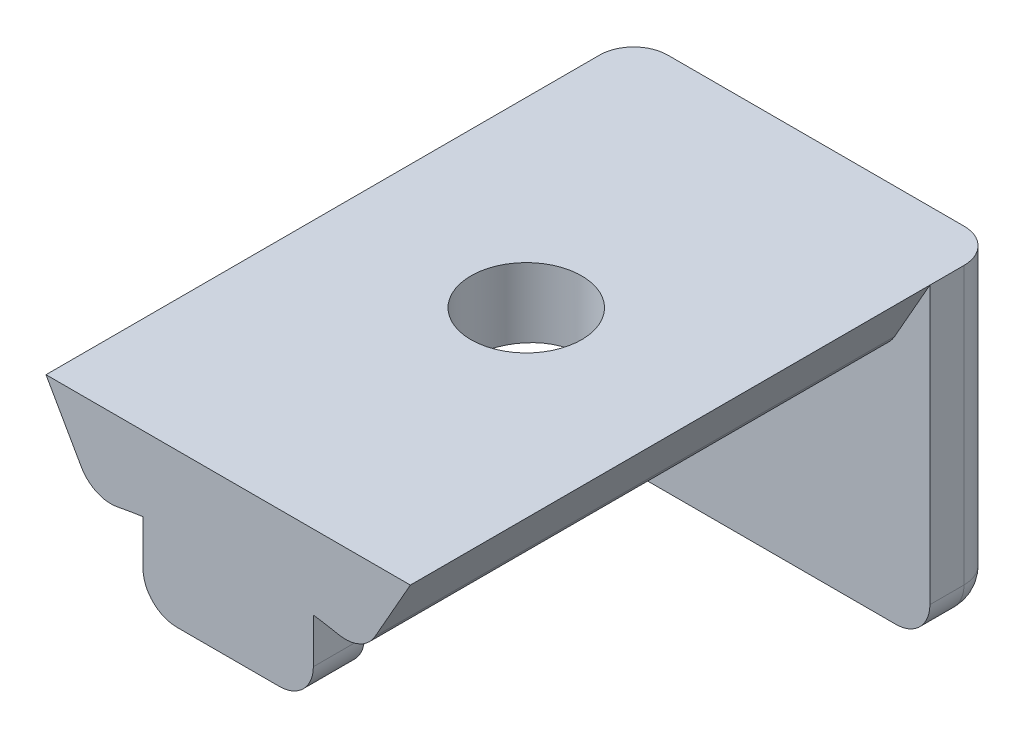
ISO-10303-21;
HEADER;
FILE_DESCRIPTION(('STEP AP214'),'2;1');
FILE_NAME('part.step','',(''),(''),'','','');
FILE_SCHEMA(('AUTOMOTIVE_DESIGN { 1 0 10303 214 1 1 1 1 }'));
ENDSEC;
DATA;
#1=APPLICATION_CONTEXT('core data for automotive mechanical design processes');
#2=APPLICATION_PROTOCOL_DEFINITION('international standard','automotive_design',2000,#1);
#3=PRODUCT_CONTEXT('',#1,'mechanical');
#4=PRODUCT('Part','Part','',(#3));
#5=PRODUCT_RELATED_PRODUCT_CATEGORY('part','',(#4));
#6=PRODUCT_DEFINITION_FORMATION('','',#4);
#7=PRODUCT_DEFINITION_CONTEXT('part definition',#1,'design');
#8=PRODUCT_DEFINITION('design','',#6,#7);
#9=PRODUCT_DEFINITION_SHAPE('','',#8);
#10=(LENGTH_UNIT() NAMED_UNIT(*) SI_UNIT(.MILLI.,.METRE.));
#11=(NAMED_UNIT(*) PLANE_ANGLE_UNIT() SI_UNIT($,.RADIAN.));
#12=(NAMED_UNIT(*) SI_UNIT($,.STERADIAN.) SOLID_ANGLE_UNIT());
#13=UNCERTAINTY_MEASURE_WITH_UNIT(LENGTH_MEASURE(1.E-05),#10,'distance_accuracy_value','');
#14=(GEOMETRIC_REPRESENTATION_CONTEXT(3) GLOBAL_UNCERTAINTY_ASSIGNED_CONTEXT((#13)) GLOBAL_UNIT_ASSIGNED_CONTEXT((#10,
#11,#12)) REPRESENTATION_CONTEXT('',''));
#15=CARTESIAN_POINT('',(0.,0.,0.));
#16=DIRECTION('',(0.,0.,1.));
#17=DIRECTION('',(1.,0.,0.));
#18=AXIS2_PLACEMENT_3D('',#15,#16,#17);
#19=CARTESIAN_POINT('',(-10.6947636705695,4.,30.5));
#20=DIRECTION('',(0.,-1.,0.));
#21=DIRECTION('',(0.,0.,-1.));
#22=AXIS2_PLACEMENT_3D('',#19,#20,#21);
#23=PLANE('',#22);
#24=DIRECTION('',(-1.,0.,0.));
#25=VECTOR('',#24,1.);
#26=CARTESIAN_POINT('',(10.6947636705695,4.,-4.));
#27=LINE('',#26,#25);
#28=CARTESIAN_POINT('',(8.69476367056949,4.,-4.));
#29=VERTEX_POINT('',#28);
#30=CARTESIAN_POINT('',(-8.6947636705695,4.,-4.));
#31=VERTEX_POINT('',#30);
#32=EDGE_CURVE('E225',#29,#31,#27,.T.);
#33=ORIENTED_EDGE('',*,*,#32,.T.);
#34=CARTESIAN_POINT('',(-8.69476367056949,4.,-2.));
#35=DIRECTION('',(0.,-1.,0.));
#36=DIRECTION('',(0.,0.,-1.));
#37=AXIS2_PLACEMENT_3D('',#34,#35,#36);
#38=CIRCLE('',#37,2.);
#39=CARTESIAN_POINT('',(-10.6947636705695,4.,-2.));
#40=VERTEX_POINT('',#39);
#41=EDGE_CURVE('E413',#31,#40,#38,.F.);
#42=ORIENTED_EDGE('',*,*,#41,.T.);
#43=DIRECTION('',(0.,0.,1.));
#44=VECTOR('',#43,1.);
#45=CARTESIAN_POINT('',(-10.6947636705695,4.,-4.));
#46=LINE('',#45,#44);
#47=CARTESIAN_POINT('',(-10.6947636705695,4.,0.));
#48=VERTEX_POINT('',#47);
#49=EDGE_CURVE('E247',#40,#48,#46,.T.);
#50=ORIENTED_EDGE('',*,*,#49,.T.);
#51=DIRECTION('',(0.,0.,-1.));
#52=VECTOR('',#51,1.);
#53=CARTESIAN_POINT('',(-10.6947636705695,4.,30.5));
#54=LINE('',#53,#52);
#55=CARTESIAN_POINT('',(-10.6947636705695,4.,30.5));
#56=VERTEX_POINT('',#55);
#57=EDGE_CURVE('E299',#56,#48,#54,.T.);
#58=ORIENTED_EDGE('',*,*,#57,.F.);
#59=DIRECTION('',(-1.,0.,0.));
#60=VECTOR('',#59,1.);
#61=CARTESIAN_POINT('',(-10.6947636705695,4.,30.5));
#62=LINE('',#61,#60);
#63=CARTESIAN_POINT('',(10.6947636705695,4.,30.5));
#64=VERTEX_POINT('',#63);
#65=EDGE_CURVE('E256',#64,#56,#62,.T.);
#66=ORIENTED_EDGE('',*,*,#65,.F.);
#67=DIRECTION('',(0.,0.,-1.));
#68=VECTOR('',#67,1.);
#69=CARTESIAN_POINT('',(10.6947636705695,4.,30.5));
#70=LINE('',#69,#68);
#71=CARTESIAN_POINT('',(10.6947636705695,4.,0.));
#72=VERTEX_POINT('',#71);
#73=EDGE_CURVE('E271',#64,#72,#70,.T.);
#74=ORIENTED_EDGE('',*,*,#73,.T.);
#75=DIRECTION('',(0.,0.,1.));
#76=VECTOR('',#75,1.);
#77=CARTESIAN_POINT('',(10.6947636705695,4.,-4.));
#78=LINE('',#77,#76);
#79=CARTESIAN_POINT('',(10.6947636705695,4.,-2.));
#80=VERTEX_POINT('',#79);
#81=EDGE_CURVE('E249',#80,#72,#78,.T.);
#82=ORIENTED_EDGE('',*,*,#81,.F.);
#83=CARTESIAN_POINT('',(8.69476367056949,4.,-2.));
#84=DIRECTION('',(0.,-1.,0.));
#85=DIRECTION('',(0.,0.,-1.));
#86=AXIS2_PLACEMENT_3D('',#83,#84,#85);
#87=CIRCLE('',#86,2.);
#88=EDGE_CURVE('E415',#80,#29,#87,.F.);
#89=ORIENTED_EDGE('',*,*,#88,.T.);
#90=EDGE_LOOP('',(#33,#42,#50,#58,#66,#74,#82,#89));
#91=FACE_BOUND('',#90,.T.);
#92=CARTESIAN_POINT('',(0.,4.,13.));
#93=DIRECTION('',(0.,1.,0.));
#94=DIRECTION('',(0.,0.,1.));
#95=AXIS2_PLACEMENT_3D('',#92,#93,#94);
#96=CIRCLE('',#95,3.25);
#97=CARTESIAN_POINT('',(0.,4.,16.25));
#98=VERTEX_POINT('',#97);
#99=EDGE_CURVE('E221',#98,#98,#96,.T.);
#100=ORIENTED_EDGE('',*,*,#99,.F.);
#101=EDGE_LOOP('',(#100));
#102=FACE_BOUND('',#101,.T.);
#103=ADVANCED_FACE('F40',(#91,#102),#23,.F.);
#104=CARTESIAN_POINT('',(-8.6215749684711,0.348529624949165,30.5));
#105=DIRECTION('',(0.869611013647313,0.49373746560626,0.));
#106=DIRECTION('',(-0.49373746560626,0.869611013647313,0.));
#107=AXIS2_PLACEMENT_3D('',#104,#105,#106);
#108=PLANE('',#107);
#109=DIRECTION('',(0.49373746560626,-0.869611013647313,0.));
#110=VECTOR('',#109,1.);
#111=CARTESIAN_POINT('',(-8.6215749684711,0.348529624949165,0.));
#112=LINE('',#111,#110);
#113=CARTESIAN_POINT('',(-8.6215749684711,0.348529624949165,0.));
#114=VERTEX_POINT('',#113);
#115=EDGE_CURVE('E246',#48,#114,#112,.T.);
#116=ORIENTED_EDGE('',*,*,#115,.T.);
#117=DIRECTION('',(0.,0.,-1.));
#118=VECTOR('',#117,1.);
#119=CARTESIAN_POINT('',(-8.6215749684711,0.348529624949165,30.5));
#120=LINE('',#119,#118);
#121=CARTESIAN_POINT('',(-8.6215749684711,0.348529624949165,30.5));
#122=VERTEX_POINT('',#121);
#123=EDGE_CURVE('E296',#122,#114,#120,.T.);
#124=ORIENTED_EDGE('',*,*,#123,.F.);
#125=DIRECTION('',(0.49373746560626,-0.869611013647313,0.));
#126=VECTOR('',#125,1.);
#127=CARTESIAN_POINT('',(-8.6215749684711,0.348529624949165,30.5));
#128=LINE('',#127,#126);
#129=EDGE_CURVE('E258',#56,#122,#128,.T.);
#130=ORIENTED_EDGE('',*,*,#129,.F.);
#131=ORIENTED_EDGE('',*,*,#57,.T.);
#132=EDGE_LOOP('',(#116,#124,#130,#131));
#133=FACE_BOUND('',#132,.T.);
#134=ADVANCED_FACE('F364',(#133),#108,.F.);
#135=CARTESIAN_POINT('',(-6.88235294117647,1.33600455616169,30.5));
#136=DIRECTION('',(0.,0.,-1.));
#137=DIRECTION('',(-1.,0.,0.));
#138=AXIS2_PLACEMENT_3D('',#135,#136,#137);
#139=CYLINDRICAL_SURFACE('',#138,2.);
#140=CARTESIAN_POINT('',(-6.88235294117647,1.33600455616169,0.));
#141=DIRECTION('',(0.,0.,1.));
#142=DIRECTION('',(-1.,0.,0.));
#143=AXIS2_PLACEMENT_3D('',#140,#141,#142);
#144=CIRCLE('',#143,2.);
#145=CARTESIAN_POINT('',(-6.5,-0.62710680806952,0.));
#146=VERTEX_POINT('',#145);
#147=EDGE_CURVE('E274',#114,#146,#144,.T.);
#148=ORIENTED_EDGE('',*,*,#147,.T.);
#149=DIRECTION('',(0.,0.,-1.));
#150=VECTOR('',#149,1.);
#151=CARTESIAN_POINT('',(-6.5,-0.62710680806952,30.5));
#152=LINE('',#151,#150);
#153=CARTESIAN_POINT('',(-6.5,-0.62710680806952,30.5));
#154=VERTEX_POINT('',#153);
#155=EDGE_CURVE('E293',#154,#146,#152,.T.);
#156=ORIENTED_EDGE('',*,*,#155,.F.);
#157=CARTESIAN_POINT('',(-6.88235294117647,1.33600455616169,30.5));
#158=DIRECTION('',(0.,0.,1.));
#159=DIRECTION('',(-1.,0.,0.));
#160=AXIS2_PLACEMENT_3D('',#157,#158,#159);
#161=CIRCLE('',#160,2.);
#162=EDGE_CURVE('E261',#122,#154,#161,.T.);
#163=ORIENTED_EDGE('',*,*,#162,.F.);
#164=ORIENTED_EDGE('',*,*,#123,.T.);
#165=EDGE_LOOP('',(#148,#156,#163,#164));
#166=FACE_BOUND('',#165,.T.);
#167=ADVANCED_FACE('F361',(#166),#139,.T.);
#168=CARTESIAN_POINT('',(0.,-34.,30.5));
#169=DIRECTION('',(0.,0.,-1.));
#170=DIRECTION('',(-1.,0.,0.));
#171=AXIS2_PLACEMENT_3D('',#168,#169,#170);
#172=CYLINDRICAL_SURFACE('',#171,34.);
#173=CARTESIAN_POINT('',(0.,0.,16.25));
#174=CARTESIAN_POINT('',(0.182108090976461,-2.01231959354162E-06,16.2499920938725));
#175=CARTESIAN_POINT('',(0.36433759154989,-0.00147865018620512,16.234642315712));
#176=CARTESIAN_POINT('',(0.723747356741201,-0.00722726483149422,16.1736391436953));
#177=CARTESIAN_POINT('',(0.900921785860087,-0.0115023458534744,16.1279520966506));
#178=CARTESIAN_POINT('',(1.24496454926346,-0.0223651185921683,16.0076140437996));
#179=CARTESIAN_POINT('',(1.41183892937562,-0.0289514382041059,15.9329802199622));
#180=CARTESIAN_POINT('',(1.7306545161744,-0.0436996150683219,15.7568998265236));
#181=CARTESIAN_POINT('',(1.88259874704598,-0.051861152254592,15.6554587023127));
#182=CARTESIAN_POINT('',(2.16778012306537,-0.0688752144983296,15.4282831560279));
#183=CARTESIAN_POINT('',(2.30096106569485,-0.0777296969172881,15.30247832106));
#184=CARTESIAN_POINT('',(2.5443525054445,-0.0951154428300179,15.0302963554583));
#185=CARTESIAN_POINT('',(2.65456195552963,-0.103646691576382,14.8839182876104));
#186=CARTESIAN_POINT('',(2.84907880479306,-0.119440288151361,14.5743961139137));
#187=CARTESIAN_POINT('',(2.93333571707974,-0.12670015099959,14.4112201422965));
#188=CARTESIAN_POINT('',(3.07323334550535,-0.13910517499152,14.0729553942709));
#189=CARTESIAN_POINT('',(3.12887471146925,-0.144250384155953,13.8978668884841));
#190=CARTESIAN_POINT('',(3.2097960787319,-0.151826151087931,13.5413179261722));
#191=CARTESIAN_POINT('',(3.23516889130796,-0.154265005630627,13.3598787130626));
#192=CARTESIAN_POINT('',(3.25511975897105,-0.156177799040296,12.9953018552829));
#193=CARTESIAN_POINT('',(3.24969855799879,-0.155651809533798,12.8121642517502));
#194=CARTESIAN_POINT('',(3.20829184034402,-0.151701912648619,12.4500279346104));
#195=CARTESIAN_POINT('',(3.1724075273935,-0.148287600908132,12.2710175300038));
#196=CARTESIAN_POINT('',(3.07125061276453,-0.13896077077724,11.921571883309));
#197=CARTESIAN_POINT('',(3.00597764498416,-0.13304822126571,11.7511367480745));
#198=CARTESIAN_POINT('',(2.84778411916793,-0.119380064895267,11.4233591731244));
#199=CARTESIAN_POINT('',(2.75481851809185,-0.111621459531144,11.2660386024036));
#200=CARTESIAN_POINT('',(2.5439110727067,-0.0951379869244641,10.9691951732876));
#201=CARTESIAN_POINT('',(2.42596856085774,-0.0864130938596052,10.8296727907315));
#202=CARTESIAN_POINT('',(2.1678893307881,-0.0689373778213708,10.5717980749409));
#203=CARTESIAN_POINT('',(2.02766518519003,-0.0601865918422638,10.4535332182617));
#204=CARTESIAN_POINT('',(1.72930712081834,-0.0436783259093938,10.242208200948));
#205=CARTESIAN_POINT('',(1.57117318449841,-0.035920846928794,10.1491480650071));
#206=CARTESIAN_POINT('',(1.24142483016382,-0.0222710199435436,9.99087818007493));
#207=CARTESIAN_POINT('',(1.06980834570561,-0.0163789585465816,9.92567271021126));
#208=CARTESIAN_POINT('',(0.717994332847011,-0.00712685715426361,9.82502640227539));
#209=CARTESIAN_POINT('',(0.537797039004437,-0.0037667479897767,9.78958475109735));
#210=CARTESIAN_POINT('',(0.174694288985642,3.39739927161618E-05,9.749582746877));
#211=CARTESIAN_POINT('',(-0.0081977506963202,0.000486001721109767,9.74490164980035));
#212=CARTESIAN_POINT('',(-0.372163826977215,-0.00154979628964528,9.76623673430385));
#213=CARTESIAN_POINT('',(-0.55323788595604,-0.0040375857938915,9.79225253752742));
#214=CARTESIAN_POINT('',(-0.908080662509738,-0.0116660794077149,9.8741427848582));
#215=CARTESIAN_POINT('',(-1.08186250698855,-0.0168017740412119,9.92996085419838));
#216=CARTESIAN_POINT('',(-1.41759546448642,-0.0291497089127371,10.0698133293091));
#217=CARTESIAN_POINT('',(-1.57954633396584,-0.0363619918820711,10.1538483157235));
#218=CARTESIAN_POINT('',(-1.88756708092171,-0.0520843150564836,10.3480497498912));
#219=CARTESIAN_POINT('',(-2.03358662113286,-0.0605982755791045,10.4582957145876));
#220=CARTESIAN_POINT('',(-2.30509061187851,-0.0779555278618262,10.7016753735345));
#221=CARTESIAN_POINT('',(-2.43057459197797,-0.0867988271608277,10.8348095919731));
#222=CARTESIAN_POINT('',(-2.65786324530359,-0.103852254205845,11.1207126017862));
#223=CARTESIAN_POINT('',(-2.7595888006263,-0.112060207194943,11.2735444386375));
#224=CARTESIAN_POINT('',(-2.93592949637888,-0.126881128069415,11.5941925889237));
#225=CARTESIAN_POINT('',(-3.01054497970663,-0.13349411612812,11.7620087127986));
#226=CARTESIAN_POINT('',(-3.13041436375668,-0.14436313670263,12.1075879374678));
#227=CARTESIAN_POINT('',(-3.17571572192917,-0.148622977149721,12.2853344522158));
#228=CARTESIAN_POINT('',(-3.23582505151646,-0.154315454630872,12.6459537482119));
#229=CARTESIAN_POINT('',(-3.25063381542466,-0.155748165141153,12.8288263961082));
#230=CARTESIAN_POINT('',(-3.24932712044039,-0.155622746594751,13.1937205431002));
#231=CARTESIAN_POINT('',(-3.23333595137165,-0.154076638234098,13.3757425042138));
#232=CARTESIAN_POINT('',(-3.17114351799199,-0.148193394086924,13.7345019402678));
#233=CARTESIAN_POINT('',(-3.124942215946,-0.143856254814163,13.9112394086073));
#234=CARTESIAN_POINT('',(-3.00367452931794,-0.13288292000383,14.2544144856663));
#235=CARTESIAN_POINT('',(-2.92861140766931,-0.126246984361925,14.4208532562225));
#236=CARTESIAN_POINT('',(-2.75176391029613,-0.11142324238222,14.7387885347149));
#237=CARTESIAN_POINT('',(-2.64997975992576,-0.103235449132311,14.890285168652));
#238=CARTESIAN_POINT('',(-2.42211236686734,-0.08619102896925,15.1746726369158));
#239=CARTESIAN_POINT('',(-2.29593661519076,-0.0773319364028485,15.3074892012866));
#240=CARTESIAN_POINT('',(-2.02304752795464,-0.0599656715421274,15.5501209076989));
#241=CARTESIAN_POINT('',(-1.8763292666583,-0.0514585842882607,15.6599305172608));
#242=CARTESIAN_POINT('',(-1.5661507267873,-0.0357345855974896,15.8536283819686));
#243=CARTESIAN_POINT('',(-1.40265223964297,-0.0285207261387026,15.9374556504878));
#244=CARTESIAN_POINT('',(-1.06393772801033,-0.0162297768003012,16.0763562900333));
#245=CARTESIAN_POINT('',(-0.888735243729674,-0.0111502656868553,16.1314622600522));
#246=CARTESIAN_POINT('',(-0.593774089395858,-0.00498449060211596,16.197532131125));
#247=CARTESIAN_POINT('',(-0.475904305047981,-0.00312396422912107,16.2171809065249));
#248=CARTESIAN_POINT('',(-0.238707068245715,-0.00063106161280263,16.2434174082723));
#249=CARTESIAN_POINT('',(-0.119379621170487,1.31916132590728E-06,16.2500051828038));
#250=CARTESIAN_POINT('',(0.,0.,16.25));
#251=B_SPLINE_CURVE_WITH_KNOTS('',3,(#173,#174,#175,#176,#177,#178,#179,#180,#181,#182,#183,
#184,#185,#186,#187,#188,#189,#190,#191,#192,#193,#194,#195,#196,#197,#198,#199,#200,#201,#202,
#203,#204,#205,#206,#207,#208,#209,#210,#211,#212,#213,#214,#215,#216,#217,#218,#219,#220,#221,
#222,#223,#224,#225,#226,#227,#228,#229,#230,#231,#232,#233,#234,#235,#236,#237,#238,#239,#240,
#241,#242,#243,#244,#245,#246,#247,#248,#249,#250),.UNSPECIFIED.,.T.,.F.,(4,2,2,2,2,2,2,2,2,2,2,
2,2,2,2,2,2,2,2,2,2,2,2,2,2,2,2,2,2,2,2,2,2,2,2,2,2,2,4),(0.,0.545888361349358,1.09238329155813,
1.63855433341305,2.18461451623297,2.7322770608193,3.27996456227537,3.828710877448,
4.37744473069516,4.92449166230481,5.4715253780744,6.01674883321188,6.56197908052414,
7.10810105195412,7.65423762103519,8.20257255533737,8.75090802685044,9.29932770523604,
9.84773240107678,10.3939831580447,10.9402271822347,11.4854415585217,12.0306671548407,
12.5775684110322,13.1244821940558,13.6731920811838,14.2218950277915,14.7697074267202,
15.3175055879889,15.8630977993476,16.4086906921991,16.9542219219219,17.4997485510061,
18.0473862732989,18.5951555352039,19.1442009694637,19.6926218664859,20.0504762915422,
20.4083293964199),.UNSPECIFIED.);
#252=CARTESIAN_POINT('',(0.,0.,16.25));
#253=VERTEX_POINT('',#252);
#254=EDGE_CURVE('E224',#253,#253,#251,.T.);
#255=ORIENTED_EDGE('',*,*,#254,.T.);
#256=EDGE_LOOP('',(#255));
#257=FACE_BOUND('',#256,.T.);
#258=CARTESIAN_POINT('',(0.,-34.,30.5));
#259=DIRECTION('',(0.,0.,-1.));
#260=DIRECTION('',(-1.,0.,0.));
#261=AXIS2_PLACEMENT_3D('',#258,#259,#260);
#262=CIRCLE('',#261,34.);
#263=CARTESIAN_POINT('',(5.,-0.369656558399531,30.5));
#264=VERTEX_POINT('',#263);
#265=CARTESIAN_POINT('',(6.5,-0.627106808069516,30.5));
#266=VERTEX_POINT('',#265);
#267=EDGE_CURVE('E263',#264,#266,#262,.T.);
#268=ORIENTED_EDGE('',*,*,#267,.F.);
#269=DIRECTION('',(0.,0.,-1.));
#270=VECTOR('',#269,1.);
#271=CARTESIAN_POINT('',(5.,-0.369656558399538,30.5));
#272=LINE('',#271,#270);
#273=CARTESIAN_POINT('',(5.,-0.369656558399538,27.5));
#274=VERTEX_POINT('',#273);
#275=EDGE_CURVE('E218',#264,#274,#272,.T.);
#276=ORIENTED_EDGE('',*,*,#275,.T.);
#277=CARTESIAN_POINT('',(0.,-34.,27.5));
#278=DIRECTION('',(0.,0.,-1.));
#279=DIRECTION('',(-1.,0.,0.));
#280=AXIS2_PLACEMENT_3D('',#277,#278,#279);
#281=CIRCLE('',#280,34.);
#282=CARTESIAN_POINT('',(-5.,-0.369656558399538,27.5));
#283=VERTEX_POINT('',#282);
#284=EDGE_CURVE('E302',#274,#283,#281,.F.);
#285=ORIENTED_EDGE('',*,*,#284,.T.);
#286=DIRECTION('',(0.,0.,-1.));
#287=VECTOR('',#286,1.);
#288=CARTESIAN_POINT('',(-5.,-0.369656558399538,30.5));
#289=LINE('',#288,#287);
#290=CARTESIAN_POINT('',(-5.,-0.369656558399531,30.5));
#291=VERTEX_POINT('',#290);
#292=EDGE_CURVE('E215',#283,#291,#289,.F.);
#293=ORIENTED_EDGE('',*,*,#292,.T.);
#294=EDGE_CURVE('E264',#154,#291,#262,.T.);
#295=ORIENTED_EDGE('',*,*,#294,.F.);
#296=ORIENTED_EDGE('',*,*,#155,.T.);
#297=CARTESIAN_POINT('',(0.,-34.,0.));
#298=DIRECTION('',(0.,0.,-1.));
#299=DIRECTION('',(-1.,0.,0.));
#300=AXIS2_PLACEMENT_3D('',#297,#298,#299);
#301=CIRCLE('',#300,34.);
#302=CARTESIAN_POINT('',(6.5,-0.627106808069516,0.));
#303=VERTEX_POINT('',#302);
#304=EDGE_CURVE('E277',#146,#303,#301,.T.);
#305=ORIENTED_EDGE('',*,*,#304,.T.);
#306=DIRECTION('',(0.,0.,-1.));
#307=VECTOR('',#306,1.);
#308=CARTESIAN_POINT('',(6.5,-0.627106808069516,30.5));
#309=LINE('',#308,#307);
#310=EDGE_CURVE('E290',#266,#303,#309,.T.);
#311=ORIENTED_EDGE('',*,*,#310,.F.);
#312=EDGE_LOOP('',(#268,#276,#285,#293,#295,#296,#305,#311));
#313=FACE_BOUND('',#312,.T.);
#314=ADVANCED_FACE('F311',(#257,#313),#172,.F.);
#315=CARTESIAN_POINT('',(6.88235294117647,1.33600455616169,30.5));
#316=DIRECTION('',(0.,0.,-1.));
#317=DIRECTION('',(-1.,0.,0.));
#318=AXIS2_PLACEMENT_3D('',#315,#316,#317);
#319=CYLINDRICAL_SURFACE('',#318,2.);
#320=CARTESIAN_POINT('',(6.88235294117647,1.33600455616169,0.));
#321=DIRECTION('',(0.,0.,1.));
#322=DIRECTION('',(1.,0.,0.));
#323=AXIS2_PLACEMENT_3D('',#320,#321,#322);
#324=CIRCLE('',#323,2.);
#325=CARTESIAN_POINT('',(8.6215749684711,0.348529624949167,0.));
#326=VERTEX_POINT('',#325);
#327=EDGE_CURVE('E280',#303,#326,#324,.T.);
#328=ORIENTED_EDGE('',*,*,#327,.T.);
#329=DIRECTION('',(0.,0.,-1.));
#330=VECTOR('',#329,1.);
#331=CARTESIAN_POINT('',(8.6215749684711,0.348529624949167,30.5));
#332=LINE('',#331,#330);
#333=CARTESIAN_POINT('',(8.6215749684711,0.348529624949167,30.5));
#334=VERTEX_POINT('',#333);
#335=EDGE_CURVE('E287',#334,#326,#332,.T.);
#336=ORIENTED_EDGE('',*,*,#335,.F.);
#337=CARTESIAN_POINT('',(6.88235294117647,1.33600455616169,30.5));
#338=DIRECTION('',(0.,0.,1.));
#339=DIRECTION('',(1.,0.,0.));
#340=AXIS2_PLACEMENT_3D('',#337,#338,#339);
#341=CIRCLE('',#340,2.);
#342=EDGE_CURVE('E267',#266,#334,#341,.T.);
#343=ORIENTED_EDGE('',*,*,#342,.F.);
#344=ORIENTED_EDGE('',*,*,#310,.T.);
#345=EDGE_LOOP('',(#328,#336,#343,#344));
#346=FACE_BOUND('',#345,.T.);
#347=ADVANCED_FACE('F354',(#346),#319,.T.);
#348=CARTESIAN_POINT('',(10.6947636705695,4.,30.5));
#349=DIRECTION('',(-0.869611013647313,0.49373746560626,0.));
#350=DIRECTION('',(-0.49373746560626,-0.869611013647313,0.));
#351=AXIS2_PLACEMENT_3D('',#348,#349,#350);
#352=PLANE('',#351);
#353=DIRECTION('',(0.49373746560626,0.869611013647313,0.));
#354=VECTOR('',#353,1.);
#355=CARTESIAN_POINT('',(10.6947636705695,4.,0.));
#356=LINE('',#355,#354);
#357=EDGE_CURVE('E259',#326,#72,#356,.T.);
#358=ORIENTED_EDGE('',*,*,#357,.T.);
#359=ORIENTED_EDGE('',*,*,#73,.F.);
#360=DIRECTION('',(0.49373746560626,0.869611013647313,0.));
#361=VECTOR('',#360,1.);
#362=CARTESIAN_POINT('',(10.6947636705695,4.,30.5));
#363=LINE('',#362,#361);
#364=EDGE_CURVE('E269',#334,#64,#363,.T.);
#365=ORIENTED_EDGE('',*,*,#364,.F.);
#366=ORIENTED_EDGE('',*,*,#335,.T.);
#367=EDGE_LOOP('',(#358,#359,#365,#366));
#368=FACE_BOUND('',#367,.T.);
#369=ADVANCED_FACE('F351',(#368),#352,.F.);
#370=CARTESIAN_POINT('',(6.88235294117647,1.33600455616169,30.5));
#371=DIRECTION('',(0.,0.,1.));
#372=DIRECTION('',(1.,0.,0.));
#373=AXIS2_PLACEMENT_3D('',#370,#371,#372);
#374=PLANE('',#373);
#375=ORIENTED_EDGE('',*,*,#294,.T.);
#376=DIRECTION('',(0.,-1.,0.));
#377=VECTOR('',#376,1.);
#378=CARTESIAN_POINT('',(-5.,-3.,30.5));
#379=LINE('',#378,#377);
#380=CARTESIAN_POINT('',(-5.,-3.,30.5));
#381=VERTEX_POINT('',#380);
#382=EDGE_CURVE('E203',#291,#381,#379,.T.);
#383=ORIENTED_EDGE('',*,*,#382,.T.);
#384=CARTESIAN_POINT('',(-3.,-3.,30.5));
#385=DIRECTION('',(0.,0.,1.));
#386=DIRECTION('',(-1.,0.,0.));
#387=AXIS2_PLACEMENT_3D('',#384,#385,#386);
#388=CIRCLE('',#387,2.);
#389=CARTESIAN_POINT('',(-3.,-5.,30.5));
#390=VERTEX_POINT('',#389);
#391=EDGE_CURVE('E401',#381,#390,#388,.T.);
#392=ORIENTED_EDGE('',*,*,#391,.T.);
#393=DIRECTION('',(1.,0.,0.));
#394=VECTOR('',#393,1.);
#395=CARTESIAN_POINT('',(3.,-5.,30.5));
#396=LINE('',#395,#394);
#397=CARTESIAN_POINT('',(3.,-5.,30.5));
#398=VERTEX_POINT('',#397);
#399=EDGE_CURVE('E188',#390,#398,#396,.T.);
#400=ORIENTED_EDGE('',*,*,#399,.T.);
#401=CARTESIAN_POINT('',(3.,-3.,30.5));
#402=DIRECTION('',(0.,0.,1.));
#403=DIRECTION('',(-1.,0.,0.));
#404=AXIS2_PLACEMENT_3D('',#401,#402,#403);
#405=CIRCLE('',#404,2.);
#406=CARTESIAN_POINT('',(5.,-3.,30.5));
#407=VERTEX_POINT('',#406);
#408=EDGE_CURVE('E199',#398,#407,#405,.T.);
#409=ORIENTED_EDGE('',*,*,#408,.T.);
#410=DIRECTION('',(0.,1.,0.));
#411=VECTOR('',#410,1.);
#412=CARTESIAN_POINT('',(5.,4.,30.5));
#413=LINE('',#412,#411);
#414=EDGE_CURVE('E196',#407,#264,#413,.T.);
#415=ORIENTED_EDGE('',*,*,#414,.T.);
#416=ORIENTED_EDGE('',*,*,#267,.T.);
#417=ORIENTED_EDGE('',*,*,#342,.T.);
#418=ORIENTED_EDGE('',*,*,#364,.T.);
#419=ORIENTED_EDGE('',*,*,#65,.T.);
#420=ORIENTED_EDGE('',*,*,#129,.T.);
#421=ORIENTED_EDGE('',*,*,#162,.T.);
#422=EDGE_LOOP('',(#375,#383,#392,#400,#409,#415,#416,#417,#418,#419,#420,#421));
#423=FACE_BOUND('',#422,.T.);
#424=ADVANCED_FACE('F347',(#423),#374,.T.);
#425=CARTESIAN_POINT('',(-8.69476367056949,-12.2476189396296,-4.));
#426=DIRECTION('',(0.,0.,1.));
#427=DIRECTION('',(1.,0.,0.));
#428=AXIS2_PLACEMENT_3D('',#425,#426,#427);
#429=CYLINDRICAL_SURFACE('',#428,2.);
#430=DIRECTION('',(0.,0.,1.));
#431=VECTOR('',#430,1.);
#432=CARTESIAN_POINT('',(-10.6947636705695,-12.2476189396296,-4.));
#433=LINE('',#432,#431);
#434=CARTESIAN_POINT('',(-10.6947636705695,-12.2476189396296,-2.));
#435=VERTEX_POINT('',#434);
#436=CARTESIAN_POINT('',(-10.6947636705695,-12.2476189396296,0.));
#437=VERTEX_POINT('',#436);
#438=EDGE_CURVE('E244',#435,#437,#433,.T.);
#439=ORIENTED_EDGE('',*,*,#438,.F.);
#440=CARTESIAN_POINT('',(-8.69476367056949,-12.2476189396296,-2.));
#441=DIRECTION('',(0.,0.,1.));
#442=DIRECTION('',(1.,0.,0.));
#443=AXIS2_PLACEMENT_3D('',#440,#441,#442);
#444=CIRCLE('',#443,2.);
#445=CARTESIAN_POINT('',(-8.69476367056949,-14.2476189396296,-2.));
#446=VERTEX_POINT('',#445);
#447=EDGE_CURVE('E411',#435,#446,#444,.T.);
#448=ORIENTED_EDGE('',*,*,#447,.T.);
#449=DIRECTION('',(0.,0.,1.));
#450=VECTOR('',#449,1.);
#451=CARTESIAN_POINT('',(-8.69476367056949,-14.2476189396296,-4.));
#452=LINE('',#451,#450);
#453=CARTESIAN_POINT('',(-8.69476367056949,-14.2476189396296,0.));
#454=VERTEX_POINT('',#453);
#455=EDGE_CURVE('E228',#446,#454,#452,.T.);
#456=ORIENTED_EDGE('',*,*,#455,.T.);
#457=CARTESIAN_POINT('',(-8.69476367056949,-12.2476189396296,0.));
#458=DIRECTION('',(0.,0.,1.));
#459=DIRECTION('',(-1.,0.,0.));
#460=AXIS2_PLACEMENT_3D('',#457,#458,#459);
#461=CIRCLE('',#460,2.);
#462=EDGE_CURVE('E230',#437,#454,#461,.T.);
#463=ORIENTED_EDGE('',*,*,#462,.F.);
#464=EDGE_LOOP('',(#439,#448,#456,#463));
#465=FACE_BOUND('',#464,.T.);
#466=ADVANCED_FACE('F335',(#465),#429,.T.);
#467=CARTESIAN_POINT('',(-10.6947636705695,-12.2476189396296,-4.));
#468=DIRECTION('',(-1.,0.,0.));
#469=DIRECTION('',(0.,0.,1.));
#470=AXIS2_PLACEMENT_3D('',#467,#468,#469);
#471=PLANE('',#470);
#472=ORIENTED_EDGE('',*,*,#49,.F.);
#473=DIRECTION('',(0.,-1.,0.));
#474=VECTOR('',#473,1.);
#475=CARTESIAN_POINT('',(-10.6947636705695,-12.2476189396296,-2.));
#476=LINE('',#475,#474);
#477=EDGE_CURVE('E422',#40,#435,#476,.T.);
#478=ORIENTED_EDGE('',*,*,#477,.T.);
#479=ORIENTED_EDGE('',*,*,#438,.T.);
#480=DIRECTION('',(0.,-1.,0.));
#481=VECTOR('',#480,1.);
#482=CARTESIAN_POINT('',(-10.6947636705695,-12.2476189396296,0.));
#483=LINE('',#482,#481);
#484=EDGE_CURVE('E229',#48,#437,#483,.T.);
#485=ORIENTED_EDGE('',*,*,#484,.F.);
#486=EDGE_LOOP('',(#472,#478,#479,#485));
#487=FACE_BOUND('',#486,.T.);
#488=ADVANCED_FACE('F331',(#487),#471,.T.);
#489=CARTESIAN_POINT('',(10.6947636705695,4.,-4.));
#490=DIRECTION('',(1.,0.,0.));
#491=DIRECTION('',(0.,1.,0.));
#492=AXIS2_PLACEMENT_3D('',#489,#490,#491);
#493=PLANE('',#492);
#494=DIRECTION('',(0.,0.,1.));
#495=VECTOR('',#494,1.);
#496=CARTESIAN_POINT('',(10.6947636705695,-12.2476189396296,-4.));
#497=LINE('',#496,#495);
#498=CARTESIAN_POINT('',(10.6947636705695,-12.2476189396296,-2.));
#499=VERTEX_POINT('',#498);
#500=CARTESIAN_POINT('',(10.6947636705695,-12.2476189396296,0.));
#501=VERTEX_POINT('',#500);
#502=EDGE_CURVE('E251',#499,#501,#497,.T.);
#503=ORIENTED_EDGE('',*,*,#502,.F.);
#504=DIRECTION('',(0.,1.,0.));
#505=VECTOR('',#504,1.);
#506=CARTESIAN_POINT('',(10.6947636705695,4.,-2.));
#507=LINE('',#506,#505);
#508=EDGE_CURVE('E409',#499,#80,#507,.T.);
#509=ORIENTED_EDGE('',*,*,#508,.T.);
#510=ORIENTED_EDGE('',*,*,#81,.T.);
#511=DIRECTION('',(0.,1.,0.));
#512=VECTOR('',#511,1.);
#513=CARTESIAN_POINT('',(10.6947636705695,4.,0.));
#514=LINE('',#513,#512);
#515=EDGE_CURVE('E239',#501,#72,#514,.T.);
#516=ORIENTED_EDGE('',*,*,#515,.F.);
#517=EDGE_LOOP('',(#503,#509,#510,#516));
#518=FACE_BOUND('',#517,.T.);
#519=ADVANCED_FACE('F334',(#518),#493,.T.);
#520=CARTESIAN_POINT('',(8.6947636705695,-12.2476189396296,-4.));
#521=DIRECTION('',(0.,0.,1.));
#522=DIRECTION('',(1.,0.,0.));
#523=AXIS2_PLACEMENT_3D('',#520,#521,#522);
#524=CYLINDRICAL_SURFACE('',#523,2.);
#525=DIRECTION('',(0.,0.,1.));
#526=VECTOR('',#525,1.);
#527=CARTESIAN_POINT('',(8.6947636705695,-14.2476189396296,-4.));
#528=LINE('',#527,#526);
#529=CARTESIAN_POINT('',(8.6947636705695,-14.2476189396296,-2.));
#530=VERTEX_POINT('',#529);
#531=CARTESIAN_POINT('',(8.6947636705695,-14.2476189396296,0.));
#532=VERTEX_POINT('',#531);
#533=EDGE_CURVE('E253',#530,#532,#528,.T.);
#534=ORIENTED_EDGE('',*,*,#533,.F.);
#535=CARTESIAN_POINT('',(8.6947636705695,-12.2476189396296,-2.));
#536=DIRECTION('',(0.,0.,1.));
#537=DIRECTION('',(1.,0.,0.));
#538=AXIS2_PLACEMENT_3D('',#535,#536,#537);
#539=CIRCLE('',#538,2.);
#540=EDGE_CURVE('E49',#530,#499,#539,.T.);
#541=ORIENTED_EDGE('',*,*,#540,.T.);
#542=ORIENTED_EDGE('',*,*,#502,.T.);
#543=CARTESIAN_POINT('',(8.6947636705695,-12.2476189396296,0.));
#544=DIRECTION('',(0.,0.,1.));
#545=DIRECTION('',(-1.,0.,0.));
#546=AXIS2_PLACEMENT_3D('',#543,#544,#545);
#547=CIRCLE('',#546,2.);
#548=EDGE_CURVE('E236',#532,#501,#547,.T.);
#549=ORIENTED_EDGE('',*,*,#548,.F.);
#550=EDGE_LOOP('',(#534,#541,#542,#549));
#551=FACE_BOUND('',#550,.T.);
#552=ADVANCED_FACE('F339',(#551),#524,.T.);
#553=CARTESIAN_POINT('',(8.6947636705695,-14.2476189396296,-4.));
#554=DIRECTION('',(0.,-1.,0.));
#555=DIRECTION('',(1.,0.,0.));
#556=AXIS2_PLACEMENT_3D('',#553,#554,#555);
#557=PLANE('',#556);
#558=ORIENTED_EDGE('',*,*,#455,.F.);
#559=DIRECTION('',(1.,0.,0.));
#560=VECTOR('',#559,1.);
#561=CARTESIAN_POINT('',(8.6947636705695,-14.2476189396296,-2.));
#562=LINE('',#561,#560);
#563=EDGE_CURVE('E13',#446,#530,#562,.T.);
#564=ORIENTED_EDGE('',*,*,#563,.T.);
#565=ORIENTED_EDGE('',*,*,#533,.T.);
#566=DIRECTION('',(1.,0.,0.));
#567=VECTOR('',#566,1.);
#568=CARTESIAN_POINT('',(8.6947636705695,-14.2476189396296,0.));
#569=LINE('',#568,#567);
#570=EDGE_CURVE('E233',#454,#532,#569,.T.);
#571=ORIENTED_EDGE('',*,*,#570,.F.);
#572=EDGE_LOOP('',(#558,#564,#565,#571));
#573=FACE_BOUND('',#572,.T.);
#574=ADVANCED_FACE('F326',(#573),#557,.T.);
#575=CARTESIAN_POINT('',(-8.69476367056949,-12.2476189396296,-4.));
#576=DIRECTION('',(0.,0.,-1.));
#577=DIRECTION('',(-1.,0.,0.));
#578=AXIS2_PLACEMENT_3D('',#575,#576,#577);
#579=PLANE('',#578);
#580=DIRECTION('',(1.,0.,0.));
#581=VECTOR('',#580,1.);
#582=CARTESIAN_POINT('',(-8.69476367056949,-12.2476189396296,-4.));
#583=LINE('',#582,#581);
#584=CARTESIAN_POINT('',(8.6947636705695,-12.2476189396296,-4.));
#585=VERTEX_POINT('',#584);
#586=CARTESIAN_POINT('',(-8.69476367056949,-12.2476189396296,-4.));
#587=VERTEX_POINT('',#586);
#588=EDGE_CURVE('E421',#585,#587,#583,.F.);
#589=ORIENTED_EDGE('',*,*,#588,.T.);
#590=DIRECTION('',(0.,-1.,0.));
#591=VECTOR('',#590,1.);
#592=CARTESIAN_POINT('',(-8.69476367056949,-12.2476189396296,-4.));
#593=LINE('',#592,#591);
#594=EDGE_CURVE('E417',#587,#31,#593,.F.);
#595=ORIENTED_EDGE('',*,*,#594,.T.);
#596=ORIENTED_EDGE('',*,*,#32,.F.);
#597=DIRECTION('',(0.,1.,0.));
#598=VECTOR('',#597,1.);
#599=CARTESIAN_POINT('',(8.6947636705695,-12.2476189396296,-4.));
#600=LINE('',#599,#598);
#601=EDGE_CURVE('E419',#29,#585,#600,.F.);
#602=ORIENTED_EDGE('',*,*,#601,.T.);
#603=EDGE_LOOP('',(#589,#595,#596,#602));
#604=FACE_BOUND('',#603,.T.);
#605=ADVANCED_FACE('F323',(#604),#579,.T.);
#606=CARTESIAN_POINT('',(-8.69476367056949,-12.2476189396296,0.));
#607=DIRECTION('',(0.,0.,-1.));
#608=DIRECTION('',(-1.,0.,0.));
#609=AXIS2_PLACEMENT_3D('',#606,#607,#608);
#610=PLANE('',#609);
#611=ORIENTED_EDGE('',*,*,#357,.F.);
#612=ORIENTED_EDGE('',*,*,#327,.F.);
#613=ORIENTED_EDGE('',*,*,#304,.F.);
#614=ORIENTED_EDGE('',*,*,#147,.F.);
#615=ORIENTED_EDGE('',*,*,#115,.F.);
#616=ORIENTED_EDGE('',*,*,#484,.T.);
#617=ORIENTED_EDGE('',*,*,#462,.T.);
#618=ORIENTED_EDGE('',*,*,#570,.T.);
#619=ORIENTED_EDGE('',*,*,#548,.T.);
#620=ORIENTED_EDGE('',*,*,#515,.T.);
#621=EDGE_LOOP('',(#611,#612,#613,#614,#615,#616,#617,#618,#619,#620));
#622=FACE_BOUND('',#621,.T.);
#623=ADVANCED_FACE('F320',(#622),#610,.F.);
#624=CARTESIAN_POINT('',(0.,-14.2476189396296,13.));
#625=DIRECTION('',(0.,1.,0.));
#626=DIRECTION('',(0.,0.,1.));
#627=AXIS2_PLACEMENT_3D('',#624,#625,#626);
#628=CYLINDRICAL_SURFACE('',#627,3.25);
#629=ORIENTED_EDGE('',*,*,#99,.T.);
#630=EDGE_LOOP('',(#629));
#631=FACE_BOUND('',#630,.T.);
#632=ORIENTED_EDGE('',*,*,#254,.F.);
#633=EDGE_LOOP('',(#632));
#634=FACE_BOUND('',#633,.T.);
#635=ADVANCED_FACE('F315',(#631,#634),#628,.F.);
#636=CARTESIAN_POINT('',(-8.69476367056949,-12.2476189396296,27.5));
#637=DIRECTION('',(0.,0.,-1.));
#638=DIRECTION('',(-1.,0.,0.));
#639=AXIS2_PLACEMENT_3D('',#636,#637,#638);
#640=PLANE('',#639);
#641=ORIENTED_EDGE('',*,*,#284,.F.);
#642=DIRECTION('',(0.,1.,0.));
#643=VECTOR('',#642,1.);
#644=CARTESIAN_POINT('',(5.,4.,27.5));
#645=LINE('',#644,#643);
#646=CARTESIAN_POINT('',(5.,-3.,27.5));
#647=VERTEX_POINT('',#646);
#648=EDGE_CURVE('E207',#647,#274,#645,.T.);
#649=ORIENTED_EDGE('',*,*,#648,.F.);
#650=CARTESIAN_POINT('',(3.,-3.,27.5));
#651=DIRECTION('',(0.,0.,-1.));
#652=DIRECTION('',(-1.,0.,0.));
#653=AXIS2_PLACEMENT_3D('',#650,#651,#652);
#654=CIRCLE('',#653,2.);
#655=CARTESIAN_POINT('',(3.,-5.,27.5));
#656=VERTEX_POINT('',#655);
#657=EDGE_CURVE('E179',#656,#647,#654,.F.);
#658=ORIENTED_EDGE('',*,*,#657,.F.);
#659=DIRECTION('',(1.,0.,0.));
#660=VECTOR('',#659,1.);
#661=CARTESIAN_POINT('',(3.,-5.,27.5));
#662=LINE('',#661,#660);
#663=CARTESIAN_POINT('',(-3.,-5.,27.5));
#664=VERTEX_POINT('',#663);
#665=EDGE_CURVE('E171',#664,#656,#662,.T.);
#666=ORIENTED_EDGE('',*,*,#665,.F.);
#667=CARTESIAN_POINT('',(-3.,-3.,27.5));
#668=DIRECTION('',(0.,0.,-1.));
#669=DIRECTION('',(-1.,0.,0.));
#670=AXIS2_PLACEMENT_3D('',#667,#668,#669);
#671=CIRCLE('',#670,2.);
#672=CARTESIAN_POINT('',(-5.,-3.,27.5));
#673=VERTEX_POINT('',#672);
#674=EDGE_CURVE('E176',#673,#664,#671,.F.);
#675=ORIENTED_EDGE('',*,*,#674,.F.);
#676=DIRECTION('',(0.,-1.,0.));
#677=VECTOR('',#676,1.);
#678=CARTESIAN_POINT('',(-5.,-3.,27.5));
#679=LINE('',#678,#677);
#680=EDGE_CURVE('E205',#283,#673,#679,.T.);
#681=ORIENTED_EDGE('',*,*,#680,.F.);
#682=EDGE_LOOP('',(#641,#649,#658,#666,#675,#681));
#683=FACE_BOUND('',#682,.T.);
#684=ADVANCED_FACE('F173',(#683),#640,.T.);
#685=CARTESIAN_POINT('',(5.,4.,-13.4536240470737));
#686=DIRECTION('',(1.,0.,0.));
#687=DIRECTION('',(0.,1.,0.));
#688=AXIS2_PLACEMENT_3D('',#685,#686,#687);
#689=PLANE('',#688);
#690=ORIENTED_EDGE('',*,*,#275,.F.);
#691=ORIENTED_EDGE('',*,*,#414,.F.);
#692=DIRECTION('',(0.,0.,1.));
#693=VECTOR('',#692,1.);
#694=CARTESIAN_POINT('',(5.,-3.,-13.4536240470737));
#695=LINE('',#694,#693);
#696=EDGE_CURVE('E210',#647,#407,#695,.T.);
#697=ORIENTED_EDGE('',*,*,#696,.F.);
#698=ORIENTED_EDGE('',*,*,#648,.T.);
#699=EDGE_LOOP('',(#690,#691,#697,#698));
#700=FACE_BOUND('',#699,.T.);
#701=ADVANCED_FACE('F433',(#700),#689,.T.);
#702=CARTESIAN_POINT('',(-5.,-3.,-13.4536240470737));
#703=DIRECTION('',(-1.,0.,0.));
#704=DIRECTION('',(0.,-1.,0.));
#705=AXIS2_PLACEMENT_3D('',#702,#703,#704);
#706=PLANE('',#705);
#707=ORIENTED_EDGE('',*,*,#292,.F.);
#708=ORIENTED_EDGE('',*,*,#680,.T.);
#709=DIRECTION('',(0.,0.,1.));
#710=VECTOR('',#709,1.);
#711=CARTESIAN_POINT('',(-5.,-3.,-13.4536240470737));
#712=LINE('',#711,#710);
#713=EDGE_CURVE('E195',#673,#381,#712,.T.);
#714=ORIENTED_EDGE('',*,*,#713,.T.);
#715=ORIENTED_EDGE('',*,*,#382,.F.);
#716=EDGE_LOOP('',(#707,#708,#714,#715));
#717=FACE_BOUND('',#716,.T.);
#718=ADVANCED_FACE('F441',(#717),#706,.T.);
#719=CARTESIAN_POINT('',(-3.,-3.,-13.4536240470737));
#720=DIRECTION('',(0.,0.,1.));
#721=DIRECTION('',(1.,0.,0.));
#722=AXIS2_PLACEMENT_3D('',#719,#720,#721);
#723=CYLINDRICAL_SURFACE('',#722,2.);
#724=ORIENTED_EDGE('',*,*,#713,.F.);
#725=ORIENTED_EDGE('',*,*,#674,.T.);
#726=DIRECTION('',(0.,0.,1.));
#727=VECTOR('',#726,1.);
#728=CARTESIAN_POINT('',(-3.,-5.,-13.4536240470737));
#729=LINE('',#728,#727);
#730=EDGE_CURVE('E183',#664,#390,#729,.T.);
#731=ORIENTED_EDGE('',*,*,#730,.T.);
#732=ORIENTED_EDGE('',*,*,#391,.F.);
#733=EDGE_LOOP('',(#724,#725,#731,#732));
#734=FACE_BOUND('',#733,.T.);
#735=ADVANCED_FACE('F193',(#734),#723,.T.);
#736=CARTESIAN_POINT('',(3.,-5.,-13.4536240470737));
#737=DIRECTION('',(0.,-1.,0.));
#738=DIRECTION('',(0.,0.,-1.));
#739=AXIS2_PLACEMENT_3D('',#736,#737,#738);
#740=PLANE('',#739);
#741=ORIENTED_EDGE('',*,*,#730,.F.);
#742=ORIENTED_EDGE('',*,*,#665,.T.);
#743=DIRECTION('',(0.,0.,1.));
#744=VECTOR('',#743,1.);
#745=CARTESIAN_POINT('',(3.,-5.,-13.4536240470737));
#746=LINE('',#745,#744);
#747=EDGE_CURVE('E182',#656,#398,#746,.T.);
#748=ORIENTED_EDGE('',*,*,#747,.T.);
#749=ORIENTED_EDGE('',*,*,#399,.F.);
#750=EDGE_LOOP('',(#741,#742,#748,#749));
#751=FACE_BOUND('',#750,.T.);
#752=ADVANCED_FACE('F186',(#751),#740,.T.);
#753=CARTESIAN_POINT('',(3.,-3.,-13.4536240470737));
#754=DIRECTION('',(0.,0.,1.));
#755=DIRECTION('',(1.,0.,0.));
#756=AXIS2_PLACEMENT_3D('',#753,#754,#755);
#757=CYLINDRICAL_SURFACE('',#756,2.);
#758=ORIENTED_EDGE('',*,*,#747,.F.);
#759=ORIENTED_EDGE('',*,*,#657,.T.);
#760=ORIENTED_EDGE('',*,*,#696,.T.);
#761=ORIENTED_EDGE('',*,*,#408,.F.);
#762=EDGE_LOOP('',(#758,#759,#760,#761));
#763=FACE_BOUND('',#762,.T.);
#764=ADVANCED_FACE('F391',(#763),#757,.T.);
#765=CARTESIAN_POINT('',(8.69476367056949,4.,-2.));
#766=DIRECTION('',(0.,1.,0.));
#767=DIRECTION('',(-1.,0.,0.));
#768=AXIS2_PLACEMENT_3D('',#765,#766,#767);
#769=CYLINDRICAL_SURFACE('',#768,2.);
#770=ORIENTED_EDGE('',*,*,#88,.F.);
#771=ORIENTED_EDGE('',*,*,#508,.F.);
#772=CARTESIAN_POINT('',(8.6947636705695,-12.2476189396296,-2.));
#773=DIRECTION('',(0.,-1.,0.));
#774=DIRECTION('',(0.,0.,-1.));
#775=AXIS2_PLACEMENT_3D('',#772,#773,#774);
#776=CIRCLE('',#775,2.);
#777=EDGE_CURVE('E44',#585,#499,#776,.T.);
#778=ORIENTED_EDGE('',*,*,#777,.F.);
#779=ORIENTED_EDGE('',*,*,#601,.F.);
#780=EDGE_LOOP('',(#770,#771,#778,#779));
#781=FACE_BOUND('',#780,.T.);
#782=ADVANCED_FACE('F42',(#781),#769,.T.);
#783=CARTESIAN_POINT('',(8.6947636705695,-12.2476189396296,-2.));
#784=DIRECTION('',(0.,0.,-1.));
#785=DIRECTION('',(-1.,0.,0.));
#786=AXIS2_PLACEMENT_3D('',#783,#784,#785);
#787=SPHERICAL_SURFACE('',#786,2.);
#788=ORIENTED_EDGE('',*,*,#777,.T.);
#789=ORIENTED_EDGE('',*,*,#540,.F.);
#790=CARTESIAN_POINT('',(8.6947636705695,-12.2476189396296,-2.));
#791=DIRECTION('',(-1.,0.,0.));
#792=DIRECTION('',(0.,0.,1.));
#793=AXIS2_PLACEMENT_3D('',#790,#791,#792);
#794=CIRCLE('',#793,2.);
#795=EDGE_CURVE('E397',#585,#530,#794,.T.);
#796=ORIENTED_EDGE('',*,*,#795,.F.);
#797=EDGE_LOOP('',(#788,#789,#796));
#798=FACE_BOUND('',#797,.T.);
#799=ADVANCED_FACE('F384',(#798),#787,.T.);
#800=CARTESIAN_POINT('',(8.6947636705695,-12.2476189396296,-2.));
#801=DIRECTION('',(1.,0.,0.));
#802=DIRECTION('',(0.,1.,0.));
#803=AXIS2_PLACEMENT_3D('',#800,#801,#802);
#804=CYLINDRICAL_SURFACE('',#803,2.);
#805=ORIENTED_EDGE('',*,*,#795,.T.);
#806=ORIENTED_EDGE('',*,*,#563,.F.);
#807=CARTESIAN_POINT('',(-8.69476367056949,-12.2476189396296,-2.));
#808=DIRECTION('',(-1.,0.,0.));
#809=DIRECTION('',(0.,0.,1.));
#810=AXIS2_PLACEMENT_3D('',#807,#808,#809);
#811=CIRCLE('',#810,2.);
#812=EDGE_CURVE('E402',#587,#446,#811,.T.);
#813=ORIENTED_EDGE('',*,*,#812,.F.);
#814=ORIENTED_EDGE('',*,*,#588,.F.);
#815=EDGE_LOOP('',(#805,#806,#813,#814));
#816=FACE_BOUND('',#815,.T.);
#817=ADVANCED_FACE('F381',(#816),#804,.T.);
#818=CARTESIAN_POINT('',(-8.69476367056949,-12.2476189396296,-2.));
#819=DIRECTION('',(0.,0.,-1.));
#820=DIRECTION('',(-1.,0.,0.));
#821=AXIS2_PLACEMENT_3D('',#818,#819,#820);
#822=SPHERICAL_SURFACE('',#821,2.);
#823=ORIENTED_EDGE('',*,*,#812,.T.);
#824=ORIENTED_EDGE('',*,*,#447,.F.);
#825=CARTESIAN_POINT('',(-8.69476367056949,-12.2476189396296,-2.));
#826=DIRECTION('',(0.,1.,0.));
#827=DIRECTION('',(0.,0.,1.));
#828=AXIS2_PLACEMENT_3D('',#825,#826,#827);
#829=CIRCLE('',#828,2.);
#830=EDGE_CURVE('E404',#587,#435,#829,.T.);
#831=ORIENTED_EDGE('',*,*,#830,.F.);
#832=EDGE_LOOP('',(#823,#824,#831));
#833=FACE_BOUND('',#832,.T.);
#834=ADVANCED_FACE('F377',(#833),#822,.T.);
#835=CARTESIAN_POINT('',(-8.69476367056949,-12.2476189396296,-2.));
#836=DIRECTION('',(0.,-1.,0.));
#837=DIRECTION('',(0.,0.,-1.));
#838=AXIS2_PLACEMENT_3D('',#835,#836,#837);
#839=CYLINDRICAL_SURFACE('',#838,2.);
#840=ORIENTED_EDGE('',*,*,#41,.F.);
#841=ORIENTED_EDGE('',*,*,#594,.F.);
#842=ORIENTED_EDGE('',*,*,#830,.T.);
#843=ORIENTED_EDGE('',*,*,#477,.F.);
#844=EDGE_LOOP('',(#840,#841,#842,#843));
#845=FACE_BOUND('',#844,.T.);
#846=ADVANCED_FACE('F374',(#845),#839,.T.);
#847=CLOSED_SHELL('',(#103,#134,#167,#314,#347,#369,#424,#466,#488,#519,#552,#574,#605,#623,
#635,#684,#701,#718,#735,#752,#764,#782,#799,#817,#834,#846));
#848=MANIFOLD_SOLID_BREP('B2',#847);
#849=ADVANCED_BREP_SHAPE_REPRESENTATION('',(#18,#848),#14);
#850=SHAPE_DEFINITION_REPRESENTATION(#9,#849);
ENDSEC;
END-ISO-10303-21;
